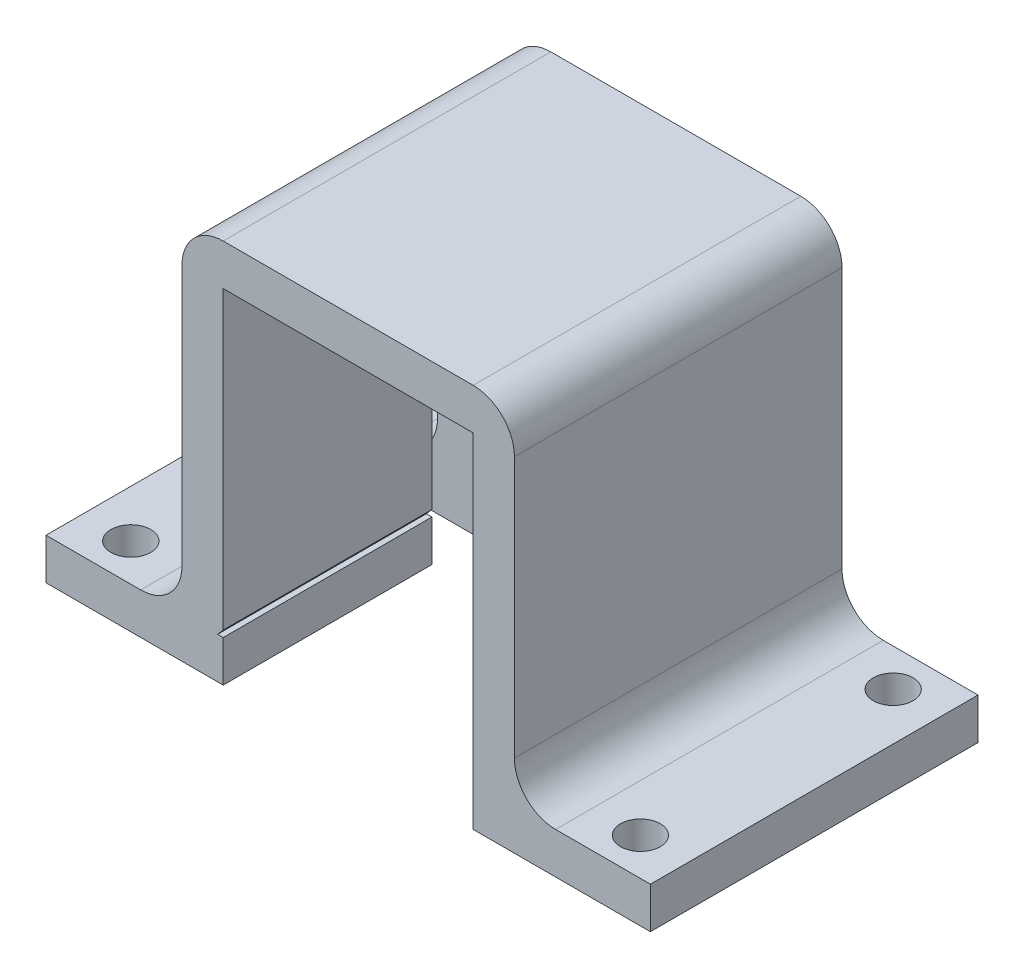
ISO-10303-21;
HEADER;
FILE_DESCRIPTION(('STEP AP214'),'2;1');
FILE_NAME('part.step','',(''),(''),'','','');
FILE_SCHEMA(('AUTOMOTIVE_DESIGN { 1 0 10303 214 1 1 1 1 }'));
ENDSEC;
DATA;
#1=APPLICATION_CONTEXT('core data for automotive mechanical design processes');
#2=APPLICATION_PROTOCOL_DEFINITION('international standard','automotive_design',2000,#1);
#3=PRODUCT_CONTEXT('',#1,'mechanical');
#4=PRODUCT('Part','Part','',(#3));
#5=PRODUCT_RELATED_PRODUCT_CATEGORY('part','',(#4));
#6=PRODUCT_DEFINITION_FORMATION('','',#4);
#7=PRODUCT_DEFINITION_CONTEXT('part definition',#1,'design');
#8=PRODUCT_DEFINITION('design','',#6,#7);
#9=PRODUCT_DEFINITION_SHAPE('','',#8);
#10=(LENGTH_UNIT() NAMED_UNIT(*) SI_UNIT(.MILLI.,.METRE.));
#11=(NAMED_UNIT(*) PLANE_ANGLE_UNIT() SI_UNIT($,.RADIAN.));
#12=(NAMED_UNIT(*) SI_UNIT($,.STERADIAN.) SOLID_ANGLE_UNIT());
#13=UNCERTAINTY_MEASURE_WITH_UNIT(LENGTH_MEASURE(1.E-05),#10,'distance_accuracy_value','');
#14=(GEOMETRIC_REPRESENTATION_CONTEXT(3) GLOBAL_UNCERTAINTY_ASSIGNED_CONTEXT((#13)) GLOBAL_UNIT_ASSIGNED_CONTEXT((#10,
#11,#12)) REPRESENTATION_CONTEXT('',''));
#15=CARTESIAN_POINT('',(0.,0.,0.));
#16=DIRECTION('',(0.,0.,1.));
#17=DIRECTION('',(1.,0.,0.));
#18=AXIS2_PLACEMENT_3D('',#15,#16,#17);
#19=CARTESIAN_POINT('',(0.,-11.,23.85));
#20=DIRECTION('',(0.,1.,0.));
#21=DIRECTION('',(-1.,0.,0.));
#22=AXIS2_PLACEMENT_3D('',#19,#20,#21);
#23=PLANE('',#22);
#24=DIRECTION('',(0.,0.,-1.));
#25=VECTOR('',#24,1.);
#26=CARTESIAN_POINT('',(-9.50714285714286,-11.,23.85));
#27=LINE('',#26,#25);
#28=CARTESIAN_POINT('',(-9.50714285714286,-11.,5.25));
#29=VERTEX_POINT('',#28);
#30=CARTESIAN_POINT('',(-9.50714285714286,-11.,0.));
#31=VERTEX_POINT('',#30);
#32=EDGE_CURVE('E367',#29,#31,#27,.T.);
#33=ORIENTED_EDGE('',*,*,#32,.F.);
#34=DIRECTION('',(1.,0.,0.));
#35=VECTOR('',#34,1.);
#36=CARTESIAN_POINT('',(0.,-11.,5.25));
#37=LINE('',#36,#35);
#38=CARTESIAN_POINT('',(-9.1,-11.,5.25));
#39=VERTEX_POINT('',#38);
#40=EDGE_CURVE('E609',#29,#39,#37,.T.);
#41=ORIENTED_EDGE('',*,*,#40,.T.);
#42=DIRECTION('',(0.,0.,-1.));
#43=VECTOR('',#42,1.);
#44=CARTESIAN_POINT('',(-9.1,-11.,23.85));
#45=LINE('',#44,#43);
#46=CARTESIAN_POINT('',(-9.1,-11.,0.));
#47=VERTEX_POINT('',#46);
#48=EDGE_CURVE('E138',#39,#47,#45,.T.);
#49=ORIENTED_EDGE('',*,*,#48,.T.);
#50=DIRECTION('',(1.,0.,0.));
#51=VECTOR('',#50,1.);
#52=CARTESIAN_POINT('',(0.,-11.,0.));
#53=LINE('',#52,#51);
#54=EDGE_CURVE('E234',#31,#47,#53,.T.);
#55=ORIENTED_EDGE('',*,*,#54,.F.);
#56=EDGE_LOOP('',(#33,#41,#49,#55));
#57=FACE_BOUND('',#56,.T.);
#58=ADVANCED_FACE('F47',(#57),#23,.T.);
#59=CARTESIAN_POINT('',(-9.1,-11.,23.85));
#60=VERTEX_POINT('',#59);
#61=CARTESIAN_POINT('',(-9.1,-11.,8.65000000000001));
#62=VERTEX_POINT('',#61);
#63=EDGE_CURVE('E70',#60,#62,#45,.T.);
#64=ORIENTED_EDGE('',*,*,#63,.T.);
#65=DIRECTION('',(-1.,0.,0.));
#66=VECTOR('',#65,1.);
#67=CARTESIAN_POINT('',(0.,-11.,8.65000000000001));
#68=LINE('',#67,#66);
#69=CARTESIAN_POINT('',(-9.50714285714286,-11.,8.65000000000001));
#70=VERTEX_POINT('',#69);
#71=EDGE_CURVE('E62',#62,#70,#68,.T.);
#72=ORIENTED_EDGE('',*,*,#71,.T.);
#73=CARTESIAN_POINT('',(-9.50714285714286,-11.,23.85));
#74=VERTEX_POINT('',#73);
#75=EDGE_CURVE('E145',#74,#70,#27,.T.);
#76=ORIENTED_EDGE('',*,*,#75,.F.);
#77=DIRECTION('',(1.,0.,0.));
#78=VECTOR('',#77,1.);
#79=CARTESIAN_POINT('',(0.,-11.,23.85));
#80=LINE('',#79,#78);
#81=EDGE_CURVE('E307',#74,#60,#80,.T.);
#82=ORIENTED_EDGE('',*,*,#81,.T.);
#83=EDGE_LOOP('',(#64,#72,#76,#82));
#84=FACE_BOUND('',#83,.T.);
#85=ADVANCED_FACE('F425',(#84),#23,.T.);
#86=CARTESIAN_POINT('',(0.,0.,23.85));
#87=DIRECTION('',(-0.756579928934907,0.65390122429374,0.));
#88=DIRECTION('',(-0.65390122429374,-0.756579928934907,0.));
#89=AXIS2_PLACEMENT_3D('',#86,#87,#88);
#90=PLANE('',#89);
#91=DIRECTION('',(0.65390122429374,0.756579928934907,0.));
#92=VECTOR('',#91,1.);
#93=CARTESIAN_POINT('',(0.,0.,5.25));
#94=LINE('',#93,#92);
#95=CARTESIAN_POINT('',(-9.1,-10.5289256198347,5.25));
#96=VERTEX_POINT('',#95);
#97=EDGE_CURVE('E419',#29,#96,#94,.T.);
#98=ORIENTED_EDGE('',*,*,#97,.F.);
#99=ORIENTED_EDGE('',*,*,#32,.T.);
#100=DIRECTION('',(0.65390122429374,0.756579928934906,0.));
#101=VECTOR('',#100,1.);
#102=CARTESIAN_POINT('',(0.,0.,0.));
#103=LINE('',#102,#101);
#104=CARTESIAN_POINT('',(-9.1,-10.5289256198347,0.));
#105=VERTEX_POINT('',#104);
#106=EDGE_CURVE('E237',#31,#105,#103,.T.);
#107=ORIENTED_EDGE('',*,*,#106,.T.);
#108=DIRECTION('',(0.,0.,-1.));
#109=VECTOR('',#108,1.);
#110=CARTESIAN_POINT('',(-9.1,-10.5289256198347,23.85));
#111=LINE('',#110,#109);
#112=EDGE_CURVE('E362',#96,#105,#111,.T.);
#113=ORIENTED_EDGE('',*,*,#112,.F.);
#114=EDGE_LOOP('',(#98,#99,#107,#113));
#115=FACE_BOUND('',#114,.T.);
#116=ADVANCED_FACE('F415',(#115),#90,.F.);
#117=DIRECTION('',(-0.65390122429374,-0.756579928934907,0.));
#118=VECTOR('',#117,1.);
#119=CARTESIAN_POINT('',(0.,0.,8.65000000000001));
#120=LINE('',#119,#118);
#121=CARTESIAN_POINT('',(-9.1,-10.5289256198347,8.65000000000001));
#122=VERTEX_POINT('',#121);
#123=EDGE_CURVE('E635',#122,#70,#120,.T.);
#124=ORIENTED_EDGE('',*,*,#123,.F.);
#125=CARTESIAN_POINT('',(-9.1,-10.5289256198347,23.85));
#126=VERTEX_POINT('',#125);
#127=EDGE_CURVE('E363',#126,#122,#111,.T.);
#128=ORIENTED_EDGE('',*,*,#127,.F.);
#129=DIRECTION('',(0.65390122429374,0.756579928934906,0.));
#130=VECTOR('',#129,1.);
#131=CARTESIAN_POINT('',(0.,0.,23.85));
#132=LINE('',#131,#130);
#133=EDGE_CURVE('E436',#74,#126,#132,.T.);
#134=ORIENTED_EDGE('',*,*,#133,.F.);
#135=ORIENTED_EDGE('',*,*,#75,.T.);
#136=EDGE_LOOP('',(#124,#128,#134,#135));
#137=FACE_BOUND('',#136,.T.);
#138=ADVANCED_FACE('F433',(#137),#90,.F.);
#139=CARTESIAN_POINT('',(-9.1,0.,23.85));
#140=DIRECTION('',(1.,0.,0.));
#141=DIRECTION('',(0.,1.,0.));
#142=AXIS2_PLACEMENT_3D('',#139,#140,#141);
#143=PLANE('',#142);
#144=DIRECTION('',(0.,0.,-1.));
#145=VECTOR('',#144,1.);
#146=CARTESIAN_POINT('',(-9.1,6.,23.85));
#147=LINE('',#146,#145);
#148=CARTESIAN_POINT('',(-9.1,6.,8.65000000000001));
#149=VERTEX_POINT('',#148);
#150=CARTESIAN_POINT('',(-9.1,6.,5.25));
#151=VERTEX_POINT('',#150);
#152=EDGE_CURVE('E490',#149,#151,#147,.T.);
#153=ORIENTED_EDGE('',*,*,#152,.T.);
#154=DIRECTION('',(0.,-1.,0.));
#155=VECTOR('',#154,1.);
#156=CARTESIAN_POINT('',(-9.1,0.,5.25));
#157=LINE('',#156,#155);
#158=EDGE_CURVE('E514',#151,#96,#157,.T.);
#159=ORIENTED_EDGE('',*,*,#158,.T.);
#160=ORIENTED_EDGE('',*,*,#112,.T.);
#161=DIRECTION('',(0.,-1.,0.));
#162=VECTOR('',#161,1.);
#163=CARTESIAN_POINT('',(-9.1,0.,0.));
#164=LINE('',#163,#162);
#165=CARTESIAN_POINT('',(-9.1,11.,0.));
#166=VERTEX_POINT('',#165);
#167=EDGE_CURVE('E242',#166,#105,#164,.T.);
#168=ORIENTED_EDGE('',*,*,#167,.F.);
#169=DIRECTION('',(0.,0.,-1.));
#170=VECTOR('',#169,1.);
#171=CARTESIAN_POINT('',(-9.1,11.,23.85));
#172=LINE('',#171,#170);
#173=CARTESIAN_POINT('',(-9.1,11.,23.85));
#174=VERTEX_POINT('',#173);
#175=EDGE_CURVE('E359',#174,#166,#172,.T.);
#176=ORIENTED_EDGE('',*,*,#175,.F.);
#177=DIRECTION('',(0.,-1.,0.));
#178=VECTOR('',#177,1.);
#179=CARTESIAN_POINT('',(-9.1,0.,23.85));
#180=LINE('',#179,#178);
#181=EDGE_CURVE('E544',#174,#126,#180,.T.);
#182=ORIENTED_EDGE('',*,*,#181,.T.);
#183=ORIENTED_EDGE('',*,*,#127,.T.);
#184=DIRECTION('',(0.,1.,0.));
#185=VECTOR('',#184,1.);
#186=CARTESIAN_POINT('',(-9.1,0.,8.65000000000001));
#187=LINE('',#186,#185);
#188=EDGE_CURVE('E603',#122,#149,#187,.T.);
#189=ORIENTED_EDGE('',*,*,#188,.T.);
#190=EDGE_LOOP('',(#153,#159,#160,#168,#176,#182,#183,#189));
#191=FACE_BOUND('',#190,.T.);
#192=ADVANCED_FACE('F616',(#191),#143,.T.);
#193=CARTESIAN_POINT('',(-12.1,0.,23.85));
#194=DIRECTION('',(1.,0.,0.));
#195=DIRECTION('',(0.,0.,-1.));
#196=AXIS2_PLACEMENT_3D('',#193,#194,#195);
#197=PLANE('',#196);
#198=DIRECTION('',(0.,-1.,0.));
#199=VECTOR('',#198,1.);
#200=CARTESIAN_POINT('',(-12.1,0.,5.25));
#201=LINE('',#200,#199);
#202=CARTESIAN_POINT('',(-12.1,6.,5.25));
#203=VERTEX_POINT('',#202);
#204=CARTESIAN_POINT('',(-12.1,-8.,5.25));
#205=VERTEX_POINT('',#204);
#206=EDGE_CURVE('E482',#203,#205,#201,.T.);
#207=ORIENTED_EDGE('',*,*,#206,.F.);
#208=DIRECTION('',(0.,0.,-1.));
#209=VECTOR('',#208,1.);
#210=CARTESIAN_POINT('',(-12.1,6.,23.85));
#211=LINE('',#210,#209);
#212=CARTESIAN_POINT('',(-12.1,6.,8.65000000000001));
#213=VERTEX_POINT('',#212);
#214=EDGE_CURVE('E11',#213,#203,#211,.T.);
#215=ORIENTED_EDGE('',*,*,#214,.F.);
#216=DIRECTION('',(0.,1.,0.));
#217=VECTOR('',#216,1.);
#218=CARTESIAN_POINT('',(-12.1,0.,8.65000000000001));
#219=LINE('',#218,#217);
#220=CARTESIAN_POINT('',(-12.1,-7.99999999999998,8.65000000000001));
#221=VERTEX_POINT('',#220);
#222=EDGE_CURVE('E601',#221,#213,#219,.T.);
#223=ORIENTED_EDGE('',*,*,#222,.F.);
#224=DIRECTION('',(0.,0.,-1.));
#225=VECTOR('',#224,1.);
#226=CARTESIAN_POINT('',(-12.1,-7.99999999999998,23.85));
#227=LINE('',#226,#225);
#228=CARTESIAN_POINT('',(-12.1,-7.99999999999998,23.85));
#229=VERTEX_POINT('',#228);
#230=EDGE_CURVE('E322',#229,#221,#227,.T.);
#231=ORIENTED_EDGE('',*,*,#230,.F.);
#232=DIRECTION('',(0.,-1.,0.));
#233=VECTOR('',#232,1.);
#234=CARTESIAN_POINT('',(-12.1,0.,23.85));
#235=LINE('',#234,#233);
#236=CARTESIAN_POINT('',(-12.1,11.,23.85));
#237=VERTEX_POINT('',#236);
#238=EDGE_CURVE('E584',#237,#229,#235,.T.);
#239=ORIENTED_EDGE('',*,*,#238,.F.);
#240=DIRECTION('',(0.,0.,-1.));
#241=VECTOR('',#240,1.);
#242=CARTESIAN_POINT('',(-12.1,11.,23.85));
#243=LINE('',#242,#241);
#244=CARTESIAN_POINT('',(-12.1,11.,0.));
#245=VERTEX_POINT('',#244);
#246=EDGE_CURVE('E326',#237,#245,#243,.T.);
#247=ORIENTED_EDGE('',*,*,#246,.T.);
#248=DIRECTION('',(0.,-1.,0.));
#249=VECTOR('',#248,1.);
#250=CARTESIAN_POINT('',(-12.1,0.,0.));
#251=LINE('',#250,#249);
#252=CARTESIAN_POINT('',(-12.1,-7.99999999999998,0.));
#253=VERTEX_POINT('',#252);
#254=EDGE_CURVE('E283',#245,#253,#251,.T.);
#255=ORIENTED_EDGE('',*,*,#254,.T.);
#256=EDGE_CURVE('E321',#205,#253,#227,.T.);
#257=ORIENTED_EDGE('',*,*,#256,.F.);
#258=EDGE_LOOP('',(#207,#215,#223,#231,#239,#247,#255,#257));
#259=FACE_BOUND('',#258,.T.);
#260=ADVANCED_FACE('F498',(#259),#197,.F.);
#261=CARTESIAN_POINT('',(-15.1,-8.,23.85));
#262=DIRECTION('',(0.,0.,-1.));
#263=DIRECTION('',(-1.,0.,0.));
#264=AXIS2_PLACEMENT_3D('',#261,#262,#263);
#265=CYLINDRICAL_SURFACE('',#264,3.);
#266=CARTESIAN_POINT('',(-15.1,-8.,5.25));
#267=DIRECTION('',(0.,0.,1.));
#268=DIRECTION('',(1.,0.,0.));
#269=AXIS2_PLACEMENT_3D('',#266,#267,#268);
#270=CIRCLE('',#269,3.);
#271=CARTESIAN_POINT('',(-15.1,-11.,5.25));
#272=VERTEX_POINT('',#271);
#273=EDGE_CURVE('E478',#205,#272,#270,.F.);
#274=ORIENTED_EDGE('',*,*,#273,.F.);
#275=ORIENTED_EDGE('',*,*,#256,.T.);
#276=CARTESIAN_POINT('',(-15.1,-8.,0.));
#277=DIRECTION('',(0.,0.,1.));
#278=DIRECTION('',(1.,0.,0.));
#279=AXIS2_PLACEMENT_3D('',#276,#277,#278);
#280=CIRCLE('',#279,3.);
#281=CARTESIAN_POINT('',(-15.1,-11.,0.));
#282=VERTEX_POINT('',#281);
#283=EDGE_CURVE('E287',#253,#282,#280,.F.);
#284=ORIENTED_EDGE('',*,*,#283,.T.);
#285=DIRECTION('',(0.,0.,-1.));
#286=VECTOR('',#285,1.);
#287=CARTESIAN_POINT('',(-15.1,-11.,23.85));
#288=LINE('',#287,#286);
#289=EDGE_CURVE('E316',#272,#282,#288,.T.);
#290=ORIENTED_EDGE('',*,*,#289,.F.);
#291=EDGE_LOOP('',(#274,#275,#284,#290));
#292=FACE_BOUND('',#291,.T.);
#293=ADVANCED_FACE('F494',(#292),#265,.F.);
#294=CARTESIAN_POINT('',(-15.1,-8.,8.65000000000001));
#295=DIRECTION('',(0.,0.,-1.));
#296=DIRECTION('',(-1.,0.,0.));
#297=AXIS2_PLACEMENT_3D('',#294,#295,#296);
#298=CIRCLE('',#297,3.);
#299=CARTESIAN_POINT('',(-15.1,-11.,8.65000000000001));
#300=VERTEX_POINT('',#299);
#301=EDGE_CURVE('E597',#300,#221,#298,.F.);
#302=ORIENTED_EDGE('',*,*,#301,.F.);
#303=CARTESIAN_POINT('',(-15.1,-11.,23.85));
#304=VERTEX_POINT('',#303);
#305=EDGE_CURVE('E317',#304,#300,#288,.T.);
#306=ORIENTED_EDGE('',*,*,#305,.F.);
#307=CARTESIAN_POINT('',(-15.1,-8.,23.85));
#308=DIRECTION('',(0.,0.,1.));
#309=DIRECTION('',(1.,0.,0.));
#310=AXIS2_PLACEMENT_3D('',#307,#308,#309);
#311=CIRCLE('',#310,3.);
#312=EDGE_CURVE('E587',#229,#304,#311,.F.);
#313=ORIENTED_EDGE('',*,*,#312,.F.);
#314=ORIENTED_EDGE('',*,*,#230,.T.);
#315=EDGE_LOOP('',(#302,#306,#313,#314));
#316=FACE_BOUND('',#315,.T.);
#317=ADVANCED_FACE('F688',(#316),#265,.F.);
#318=CARTESIAN_POINT('',(0.,-11.,23.85));
#319=DIRECTION('',(0.,1.,0.));
#320=DIRECTION('',(-1.,0.,0.));
#321=AXIS2_PLACEMENT_3D('',#318,#319,#320);
#322=PLANE('',#321);
#323=CARTESIAN_POINT('',(-18.55,-11.,2.72499999999999));
#324=DIRECTION('',(0.,1.,0.));
#325=DIRECTION('',(1.,0.,0.));
#326=AXIS2_PLACEMENT_3D('',#323,#324,#325);
#327=CIRCLE('',#326,1.45);
#328=CARTESIAN_POINT('',(-17.1,-11.,2.72499999999999));
#329=VERTEX_POINT('',#328);
#330=EDGE_CURVE('E526',#329,#329,#327,.T.);
#331=ORIENTED_EDGE('',*,*,#330,.F.);
#332=EDGE_LOOP('',(#331));
#333=FACE_BOUND('',#332,.T.);
#334=DIRECTION('',(0.,0.,-1.));
#335=VECTOR('',#334,1.);
#336=CARTESIAN_POINT('',(-22.,-11.,23.85));
#337=LINE('',#336,#335);
#338=CARTESIAN_POINT('',(-22.,-11.,5.25));
#339=VERTEX_POINT('',#338);
#340=CARTESIAN_POINT('',(-22.,-11.,0.));
#341=VERTEX_POINT('',#340);
#342=EDGE_CURVE('E221',#339,#341,#337,.T.);
#343=ORIENTED_EDGE('',*,*,#342,.F.);
#344=DIRECTION('',(1.,0.,0.));
#345=VECTOR('',#344,1.);
#346=CARTESIAN_POINT('',(0.,-11.,5.25));
#347=LINE('',#346,#345);
#348=EDGE_CURVE('E496',#339,#272,#347,.T.);
#349=ORIENTED_EDGE('',*,*,#348,.T.);
#350=ORIENTED_EDGE('',*,*,#289,.T.);
#351=DIRECTION('',(1.,0.,0.));
#352=VECTOR('',#351,1.);
#353=CARTESIAN_POINT('',(0.,-11.,0.));
#354=LINE('',#353,#352);
#355=EDGE_CURVE('E291',#341,#282,#354,.T.);
#356=ORIENTED_EDGE('',*,*,#355,.F.);
#357=EDGE_LOOP('',(#343,#349,#350,#356));
#358=FACE_BOUND('',#357,.T.);
#359=ADVANCED_FACE('F508',(#333,#358),#322,.T.);
#360=CARTESIAN_POINT('',(-18.55,-11.,21.125));
#361=DIRECTION('',(0.,1.,0.));
#362=DIRECTION('',(-1.,0.,0.));
#363=AXIS2_PLACEMENT_3D('',#360,#361,#362);
#364=CIRCLE('',#363,1.45);
#365=CARTESIAN_POINT('',(-20.,-11.,21.125));
#366=VERTEX_POINT('',#365);
#367=EDGE_CURVE('E376',#366,#366,#364,.T.);
#368=ORIENTED_EDGE('',*,*,#367,.F.);
#369=EDGE_LOOP('',(#368));
#370=FACE_BOUND('',#369,.T.);
#371=ORIENTED_EDGE('',*,*,#305,.T.);
#372=DIRECTION('',(-1.,0.,0.));
#373=VECTOR('',#372,1.);
#374=CARTESIAN_POINT('',(0.,-11.,8.65000000000001));
#375=LINE('',#374,#373);
#376=CARTESIAN_POINT('',(-22.,-11.,8.65000000000001));
#377=VERTEX_POINT('',#376);
#378=EDGE_CURVE('E594',#300,#377,#375,.T.);
#379=ORIENTED_EDGE('',*,*,#378,.T.);
#380=CARTESIAN_POINT('',(-22.,-11.,23.85));
#381=VERTEX_POINT('',#380);
#382=EDGE_CURVE('E313',#381,#377,#337,.T.);
#383=ORIENTED_EDGE('',*,*,#382,.F.);
#384=DIRECTION('',(1.,0.,0.));
#385=VECTOR('',#384,1.);
#386=CARTESIAN_POINT('',(0.,-11.,23.85));
#387=LINE('',#386,#385);
#388=EDGE_CURVE('E206',#381,#304,#387,.T.);
#389=ORIENTED_EDGE('',*,*,#388,.T.);
#390=EDGE_LOOP('',(#371,#379,#383,#389));
#391=FACE_BOUND('',#390,.T.);
#392=ADVANCED_FACE('F591',(#370,#391),#322,.T.);
#393=CARTESIAN_POINT('',(-22.,0.,23.85));
#394=DIRECTION('',(1.,0.,0.));
#395=DIRECTION('',(0.,0.,-1.));
#396=AXIS2_PLACEMENT_3D('',#393,#394,#395);
#397=PLANE('',#396);
#398=DIRECTION('',(0.,-1.,0.));
#399=VECTOR('',#398,1.);
#400=CARTESIAN_POINT('',(-22.,0.,5.25));
#401=LINE('',#400,#399);
#402=CARTESIAN_POINT('',(-22.,-14.,5.25));
#403=VERTEX_POINT('',#402);
#404=EDGE_CURVE('E511',#339,#403,#401,.T.);
#405=ORIENTED_EDGE('',*,*,#404,.F.);
#406=ORIENTED_EDGE('',*,*,#342,.T.);
#407=DIRECTION('',(0.,-1.,0.));
#408=VECTOR('',#407,1.);
#409=CARTESIAN_POINT('',(-22.,0.,0.));
#410=LINE('',#409,#408);
#411=CARTESIAN_POINT('',(-22.,-14.,0.));
#412=VERTEX_POINT('',#411);
#413=EDGE_CURVE('E295',#341,#412,#410,.T.);
#414=ORIENTED_EDGE('',*,*,#413,.T.);
#415=DIRECTION('',(0.,0.,-1.));
#416=VECTOR('',#415,1.);
#417=CARTESIAN_POINT('',(-22.,-14.,23.85));
#418=LINE('',#417,#416);
#419=EDGE_CURVE('E222',#403,#412,#418,.T.);
#420=ORIENTED_EDGE('',*,*,#419,.F.);
#421=EDGE_LOOP('',(#405,#406,#414,#420));
#422=FACE_BOUND('',#421,.T.);
#423=ADVANCED_FACE('F799',(#422),#397,.F.);
#424=DIRECTION('',(0.,1.,0.));
#425=VECTOR('',#424,1.);
#426=CARTESIAN_POINT('',(-22.,0.,8.65000000000001));
#427=LINE('',#426,#425);
#428=CARTESIAN_POINT('',(-22.,-14.,8.65000000000001));
#429=VERTEX_POINT('',#428);
#430=EDGE_CURVE('E217',#429,#377,#427,.T.);
#431=ORIENTED_EDGE('',*,*,#430,.F.);
#432=CARTESIAN_POINT('',(-22.,-14.,23.85));
#433=VERTEX_POINT('',#432);
#434=EDGE_CURVE('E213',#433,#429,#418,.T.);
#435=ORIENTED_EDGE('',*,*,#434,.F.);
#436=DIRECTION('',(0.,-1.,0.));
#437=VECTOR('',#436,1.);
#438=CARTESIAN_POINT('',(-22.,0.,23.85));
#439=LINE('',#438,#437);
#440=EDGE_CURVE('E197',#381,#433,#439,.T.);
#441=ORIENTED_EDGE('',*,*,#440,.F.);
#442=ORIENTED_EDGE('',*,*,#382,.T.);
#443=EDGE_LOOP('',(#431,#435,#441,#442));
#444=FACE_BOUND('',#443,.T.);
#445=ADVANCED_FACE('F214',(#444),#397,.F.);
#446=CARTESIAN_POINT('',(0.,-14.,23.85));
#447=DIRECTION('',(0.,1.,0.));
#448=DIRECTION('',(-1.,0.,0.));
#449=AXIS2_PLACEMENT_3D('',#446,#447,#448);
#450=PLANE('',#449);
#451=CARTESIAN_POINT('',(-18.55,-14.,2.72499999999999));
#452=DIRECTION('',(0.,1.,0.));
#453=DIRECTION('',(-1.,0.,0.));
#454=AXIS2_PLACEMENT_3D('',#451,#452,#453);
#455=CIRCLE('',#454,1.45);
#456=CARTESIAN_POINT('',(-20.,-14.,2.72499999999999));
#457=VERTEX_POINT('',#456);
#458=EDGE_CURVE('E375',#457,#457,#455,.T.);
#459=ORIENTED_EDGE('',*,*,#458,.T.);
#460=EDGE_LOOP('',(#459));
#461=FACE_BOUND('',#460,.T.);
#462=DIRECTION('',(1.,0.,0.));
#463=VECTOR('',#462,1.);
#464=CARTESIAN_POINT('',(-22.1,-14.,5.25));
#465=LINE('',#464,#463);
#466=CARTESIAN_POINT('',(-9.1,-14.,5.25));
#467=VERTEX_POINT('',#466);
#468=EDGE_CURVE('E400',#403,#467,#465,.T.);
#469=ORIENTED_EDGE('',*,*,#468,.F.);
#470=ORIENTED_EDGE('',*,*,#419,.T.);
#471=DIRECTION('',(1.,0.,0.));
#472=VECTOR('',#471,1.);
#473=CARTESIAN_POINT('',(0.,-14.,0.));
#474=LINE('',#473,#472);
#475=CARTESIAN_POINT('',(-9.1,-14.,0.));
#476=VERTEX_POINT('',#475);
#477=EDGE_CURVE('E299',#412,#476,#474,.T.);
#478=ORIENTED_EDGE('',*,*,#477,.T.);
#479=DIRECTION('',(0.,0.,-1.));
#480=VECTOR('',#479,1.);
#481=CARTESIAN_POINT('',(-9.1,-14.,23.85));
#482=LINE('',#481,#480);
#483=EDGE_CURVE('E310',#467,#476,#482,.T.);
#484=ORIENTED_EDGE('',*,*,#483,.F.);
#485=EDGE_LOOP('',(#469,#470,#478,#484));
#486=FACE_BOUND('',#485,.T.);
#487=ADVANCED_FACE('F399',(#461,#486),#450,.F.);
#488=CARTESIAN_POINT('',(-18.55,-14.,21.125));
#489=DIRECTION('',(0.,1.,0.));
#490=DIRECTION('',(-1.,0.,0.));
#491=AXIS2_PLACEMENT_3D('',#488,#489,#490);
#492=CIRCLE('',#491,1.45);
#493=CARTESIAN_POINT('',(-20.,-14.,21.125));
#494=VERTEX_POINT('',#493);
#495=EDGE_CURVE('E371',#494,#494,#492,.T.);
#496=ORIENTED_EDGE('',*,*,#495,.T.);
#497=EDGE_LOOP('',(#496));
#498=FACE_BOUND('',#497,.T.);
#499=DIRECTION('',(1.,0.,0.));
#500=VECTOR('',#499,1.);
#501=CARTESIAN_POINT('',(-22.1,-14.,8.65000000000001));
#502=LINE('',#501,#500);
#503=CARTESIAN_POINT('',(-9.1,-14.,8.65000000000001));
#504=VERTEX_POINT('',#503);
#505=EDGE_CURVE('E626',#429,#504,#502,.T.);
#506=ORIENTED_EDGE('',*,*,#505,.T.);
#507=CARTESIAN_POINT('',(-9.1,-14.,23.85));
#508=VERTEX_POINT('',#507);
#509=EDGE_CURVE('E226',#508,#504,#482,.T.);
#510=ORIENTED_EDGE('',*,*,#509,.F.);
#511=DIRECTION('',(1.,0.,0.));
#512=VECTOR('',#511,1.);
#513=CARTESIAN_POINT('',(0.,-14.,23.85));
#514=LINE('',#513,#512);
#515=EDGE_CURVE('E203',#433,#508,#514,.T.);
#516=ORIENTED_EDGE('',*,*,#515,.F.);
#517=ORIENTED_EDGE('',*,*,#434,.T.);
#518=EDGE_LOOP('',(#506,#510,#516,#517));
#519=FACE_BOUND('',#518,.T.);
#520=ADVANCED_FACE('F224',(#498,#519),#450,.F.);
#521=CARTESIAN_POINT('',(-9.1,0.,23.85));
#522=DIRECTION('',(1.,0.,0.));
#523=DIRECTION('',(0.,0.,-1.));
#524=AXIS2_PLACEMENT_3D('',#521,#522,#523);
#525=PLANE('',#524);
#526=ORIENTED_EDGE('',*,*,#48,.F.);
#527=DIRECTION('',(0.,-1.,0.));
#528=VECTOR('',#527,1.);
#529=CARTESIAN_POINT('',(-9.1,0.,5.25));
#530=LINE('',#529,#528);
#531=EDGE_CURVE('E55',#39,#467,#530,.T.);
#532=ORIENTED_EDGE('',*,*,#531,.T.);
#533=ORIENTED_EDGE('',*,*,#483,.T.);
#534=DIRECTION('',(0.,-1.,0.));
#535=VECTOR('',#534,1.);
#536=CARTESIAN_POINT('',(-9.1,0.,0.));
#537=LINE('',#536,#535);
#538=EDGE_CURVE('E303',#47,#476,#537,.T.);
#539=ORIENTED_EDGE('',*,*,#538,.F.);
#540=EDGE_LOOP('',(#526,#532,#533,#539));
#541=FACE_BOUND('',#540,.T.);
#542=ADVANCED_FACE('F388',(#541),#525,.T.);
#543=ORIENTED_EDGE('',*,*,#509,.T.);
#544=DIRECTION('',(0.,1.,0.));
#545=VECTOR('',#544,1.);
#546=CARTESIAN_POINT('',(-9.1,0.,8.65000000000001));
#547=LINE('',#546,#545);
#548=EDGE_CURVE('E370',#504,#62,#547,.T.);
#549=ORIENTED_EDGE('',*,*,#548,.T.);
#550=ORIENTED_EDGE('',*,*,#63,.F.);
#551=DIRECTION('',(0.,-1.,0.));
#552=VECTOR('',#551,1.);
#553=CARTESIAN_POINT('',(-9.1,0.,23.85));
#554=LINE('',#553,#552);
#555=EDGE_CURVE('E228',#60,#508,#554,.T.);
#556=ORIENTED_EDGE('',*,*,#555,.T.);
#557=EDGE_LOOP('',(#543,#549,#550,#556));
#558=FACE_BOUND('',#557,.T.);
#559=ADVANCED_FACE('F438',(#558),#525,.T.);
#560=CARTESIAN_POINT('',(0.,11.,23.85));
#561=DIRECTION('',(0.,1.,0.));
#562=DIRECTION('',(0.,0.,1.));
#563=AXIS2_PLACEMENT_3D('',#560,#561,#562);
#564=PLANE('',#563);
#565=DIRECTION('',(1.,0.,0.));
#566=VECTOR('',#565,1.);
#567=CARTESIAN_POINT('',(0.,11.,0.));
#568=LINE('',#567,#566);
#569=CARTESIAN_POINT('',(9.1,11.,0.));
#570=VERTEX_POINT('',#569);
#571=EDGE_CURVE('E246',#166,#570,#568,.T.);
#572=ORIENTED_EDGE('',*,*,#571,.T.);
#573=DIRECTION('',(0.,0.,-1.));
#574=VECTOR('',#573,1.);
#575=CARTESIAN_POINT('',(9.1,11.,23.85));
#576=LINE('',#575,#574);
#577=CARTESIAN_POINT('',(9.1,11.,23.85));
#578=VERTEX_POINT('',#577);
#579=EDGE_CURVE('E355',#578,#570,#576,.T.);
#580=ORIENTED_EDGE('',*,*,#579,.F.);
#581=DIRECTION('',(1.,0.,0.));
#582=VECTOR('',#581,1.);
#583=CARTESIAN_POINT('',(0.,11.,23.85));
#584=LINE('',#583,#582);
#585=EDGE_CURVE('E548',#174,#578,#584,.T.);
#586=ORIENTED_EDGE('',*,*,#585,.F.);
#587=ORIENTED_EDGE('',*,*,#175,.T.);
#588=EDGE_LOOP('',(#572,#580,#586,#587));
#589=FACE_BOUND('',#588,.T.);
#590=ADVANCED_FACE('F646',(#589),#564,.F.);
#591=CARTESIAN_POINT('',(9.1,0.,23.85));
#592=DIRECTION('',(1.,0.,0.));
#593=DIRECTION('',(0.,0.,-1.));
#594=AXIS2_PLACEMENT_3D('',#591,#592,#593);
#595=PLANE('',#594);
#596=DIRECTION('',(0.,-1.,0.));
#597=VECTOR('',#596,1.);
#598=CARTESIAN_POINT('',(9.1,0.,0.));
#599=LINE('',#598,#597);
#600=CARTESIAN_POINT('',(9.1,-14.,0.));
#601=VERTEX_POINT('',#600);
#602=EDGE_CURVE('E249',#570,#601,#599,.T.);
#603=ORIENTED_EDGE('',*,*,#602,.T.);
#604=DIRECTION('',(0.,0.,-1.));
#605=VECTOR('',#604,1.);
#606=CARTESIAN_POINT('',(9.1,-14.,23.85));
#607=LINE('',#606,#605);
#608=CARTESIAN_POINT('',(9.1,-14.,23.85));
#609=VERTEX_POINT('',#608);
#610=EDGE_CURVE('E351',#609,#601,#607,.T.);
#611=ORIENTED_EDGE('',*,*,#610,.F.);
#612=DIRECTION('',(0.,-1.,0.));
#613=VECTOR('',#612,1.);
#614=CARTESIAN_POINT('',(9.1,0.,23.85));
#615=LINE('',#614,#613);
#616=EDGE_CURVE('E551',#578,#609,#615,.T.);
#617=ORIENTED_EDGE('',*,*,#616,.F.);
#618=ORIENTED_EDGE('',*,*,#579,.T.);
#619=EDGE_LOOP('',(#603,#611,#617,#618));
#620=FACE_BOUND('',#619,.T.);
#621=ADVANCED_FACE('F651',(#620),#595,.F.);
#622=CARTESIAN_POINT('',(0.,-14.,23.85));
#623=DIRECTION('',(0.,1.,0.));
#624=DIRECTION('',(0.,0.,1.));
#625=AXIS2_PLACEMENT_3D('',#622,#623,#624);
#626=PLANE('',#625);
#627=CARTESIAN_POINT('',(18.55,-14.,21.125));
#628=DIRECTION('',(0.,1.,0.));
#629=DIRECTION('',(0.,0.,1.));
#630=AXIS2_PLACEMENT_3D('',#627,#628,#629);
#631=CIRCLE('',#630,1.45);
#632=CARTESIAN_POINT('',(18.55,-14.,22.575));
#633=VERTEX_POINT('',#632);
#634=EDGE_CURVE('E238',#633,#633,#631,.T.);
#635=ORIENTED_EDGE('',*,*,#634,.T.);
#636=EDGE_LOOP('',(#635));
#637=FACE_BOUND('',#636,.T.);
#638=CARTESIAN_POINT('',(18.55,-14.,2.72499999999999));
#639=DIRECTION('',(0.,1.,0.));
#640=DIRECTION('',(0.,0.,1.));
#641=AXIS2_PLACEMENT_3D('',#638,#639,#640);
#642=CIRCLE('',#641,1.45);
#643=CARTESIAN_POINT('',(18.55,-14.,4.17499999999999));
#644=VERTEX_POINT('',#643);
#645=EDGE_CURVE('E380',#644,#644,#642,.T.);
#646=ORIENTED_EDGE('',*,*,#645,.T.);
#647=EDGE_LOOP('',(#646));
#648=FACE_BOUND('',#647,.T.);
#649=DIRECTION('',(1.,0.,0.));
#650=VECTOR('',#649,1.);
#651=CARTESIAN_POINT('',(0.,-14.,0.));
#652=LINE('',#651,#650);
#653=CARTESIAN_POINT('',(22.,-14.,0.));
#654=VERTEX_POINT('',#653);
#655=EDGE_CURVE('E252',#601,#654,#652,.T.);
#656=ORIENTED_EDGE('',*,*,#655,.T.);
#657=DIRECTION('',(0.,0.,-1.));
#658=VECTOR('',#657,1.);
#659=CARTESIAN_POINT('',(22.,-14.,23.85));
#660=LINE('',#659,#658);
#661=CARTESIAN_POINT('',(22.,-14.,23.85));
#662=VERTEX_POINT('',#661);
#663=EDGE_CURVE('E348',#662,#654,#660,.T.);
#664=ORIENTED_EDGE('',*,*,#663,.F.);
#665=DIRECTION('',(1.,0.,0.));
#666=VECTOR('',#665,1.);
#667=CARTESIAN_POINT('',(0.,-14.,23.85));
#668=LINE('',#667,#666);
#669=EDGE_CURVE('E554',#609,#662,#668,.T.);
#670=ORIENTED_EDGE('',*,*,#669,.F.);
#671=ORIENTED_EDGE('',*,*,#610,.T.);
#672=EDGE_LOOP('',(#656,#664,#670,#671));
#673=FACE_BOUND('',#672,.T.);
#674=ADVANCED_FACE('F657',(#637,#648,#673),#626,.F.);
#675=CARTESIAN_POINT('',(22.,0.,23.85));
#676=DIRECTION('',(1.,0.,0.));
#677=DIRECTION('',(0.,1.,0.));
#678=AXIS2_PLACEMENT_3D('',#675,#676,#677);
#679=PLANE('',#678);
#680=DIRECTION('',(0.,-1.,0.));
#681=VECTOR('',#680,1.);
#682=CARTESIAN_POINT('',(22.,0.,0.));
#683=LINE('',#682,#681);
#684=CARTESIAN_POINT('',(22.,-11.,0.));
#685=VERTEX_POINT('',#684);
#686=EDGE_CURVE('E256',#685,#654,#683,.T.);
#687=ORIENTED_EDGE('',*,*,#686,.F.);
#688=DIRECTION('',(0.,0.,-1.));
#689=VECTOR('',#688,1.);
#690=CARTESIAN_POINT('',(22.,-11.,23.85));
#691=LINE('',#690,#689);
#692=CARTESIAN_POINT('',(22.,-11.,23.85));
#693=VERTEX_POINT('',#692);
#694=EDGE_CURVE('E345',#693,#685,#691,.T.);
#695=ORIENTED_EDGE('',*,*,#694,.F.);
#696=DIRECTION('',(0.,-1.,0.));
#697=VECTOR('',#696,1.);
#698=CARTESIAN_POINT('',(22.,0.,23.85));
#699=LINE('',#698,#697);
#700=EDGE_CURVE('E557',#693,#662,#699,.T.);
#701=ORIENTED_EDGE('',*,*,#700,.T.);
#702=ORIENTED_EDGE('',*,*,#663,.T.);
#703=EDGE_LOOP('',(#687,#695,#701,#702));
#704=FACE_BOUND('',#703,.T.);
#705=ADVANCED_FACE('F661',(#704),#679,.T.);
#706=CARTESIAN_POINT('',(0.,-11.,23.85));
#707=DIRECTION('',(0.,1.,0.));
#708=DIRECTION('',(-1.,0.,0.));
#709=AXIS2_PLACEMENT_3D('',#706,#707,#708);
#710=PLANE('',#709);
#711=CARTESIAN_POINT('',(18.55,-11.,21.125));
#712=DIRECTION('',(0.,1.,0.));
#713=DIRECTION('',(1.,0.,0.));
#714=AXIS2_PLACEMENT_3D('',#711,#712,#713);
#715=CIRCLE('',#714,1.45);
#716=CARTESIAN_POINT('',(20.,-11.,21.125));
#717=VERTEX_POINT('',#716);
#718=EDGE_CURVE('E525',#717,#717,#715,.T.);
#719=ORIENTED_EDGE('',*,*,#718,.F.);
#720=EDGE_LOOP('',(#719));
#721=FACE_BOUND('',#720,.T.);
#722=CARTESIAN_POINT('',(18.55,-11.,2.72499999999999));
#723=DIRECTION('',(0.,1.,0.));
#724=DIRECTION('',(-1.,0.,0.));
#725=AXIS2_PLACEMENT_3D('',#722,#723,#724);
#726=CIRCLE('',#725,1.45);
#727=CARTESIAN_POINT('',(17.1,-11.,2.72499999999999));
#728=VERTEX_POINT('',#727);
#729=EDGE_CURVE('E521',#728,#728,#726,.T.);
#730=ORIENTED_EDGE('',*,*,#729,.F.);
#731=EDGE_LOOP('',(#730));
#732=FACE_BOUND('',#731,.T.);
#733=DIRECTION('',(1.,0.,0.));
#734=VECTOR('',#733,1.);
#735=CARTESIAN_POINT('',(0.,-11.,0.));
#736=LINE('',#735,#734);
#737=CARTESIAN_POINT('',(15.1,-11.,0.));
#738=VERTEX_POINT('',#737);
#739=EDGE_CURVE('E260',#738,#685,#736,.T.);
#740=ORIENTED_EDGE('',*,*,#739,.F.);
#741=DIRECTION('',(0.,0.,-1.));
#742=VECTOR('',#741,1.);
#743=CARTESIAN_POINT('',(15.1,-11.,23.85));
#744=LINE('',#743,#742);
#745=CARTESIAN_POINT('',(15.1,-11.,23.85));
#746=VERTEX_POINT('',#745);
#747=EDGE_CURVE('E342',#746,#738,#744,.T.);
#748=ORIENTED_EDGE('',*,*,#747,.F.);
#749=DIRECTION('',(1.,0.,0.));
#750=VECTOR('',#749,1.);
#751=CARTESIAN_POINT('',(0.,-11.,23.85));
#752=LINE('',#751,#750);
#753=EDGE_CURVE('E561',#746,#693,#752,.T.);
#754=ORIENTED_EDGE('',*,*,#753,.T.);
#755=ORIENTED_EDGE('',*,*,#694,.T.);
#756=EDGE_LOOP('',(#740,#748,#754,#755));
#757=FACE_BOUND('',#756,.T.);
#758=ADVANCED_FACE('F664',(#721,#732,#757),#710,.T.);
#759=CARTESIAN_POINT('',(15.1,-8.,23.85));
#760=DIRECTION('',(0.,0.,-1.));
#761=DIRECTION('',(-1.,0.,0.));
#762=AXIS2_PLACEMENT_3D('',#759,#760,#761);
#763=CYLINDRICAL_SURFACE('',#762,3.);
#764=CARTESIAN_POINT('',(15.1,-8.,0.));
#765=DIRECTION('',(0.,0.,1.));
#766=DIRECTION('',(1.,0.,0.));
#767=AXIS2_PLACEMENT_3D('',#764,#765,#766);
#768=CIRCLE('',#767,3.);
#769=CARTESIAN_POINT('',(12.1,-7.99999999999998,0.));
#770=VERTEX_POINT('',#769);
#771=EDGE_CURVE('E264',#770,#738,#768,.T.);
#772=ORIENTED_EDGE('',*,*,#771,.F.);
#773=DIRECTION('',(0.,0.,-1.));
#774=VECTOR('',#773,1.);
#775=CARTESIAN_POINT('',(12.1,-7.99999999999998,23.85));
#776=LINE('',#775,#774);
#777=CARTESIAN_POINT('',(12.1,-7.99999999999998,23.85));
#778=VERTEX_POINT('',#777);
#779=EDGE_CURVE('E339',#778,#770,#776,.T.);
#780=ORIENTED_EDGE('',*,*,#779,.F.);
#781=CARTESIAN_POINT('',(15.1,-8.,23.85));
#782=DIRECTION('',(0.,0.,1.));
#783=DIRECTION('',(1.,0.,0.));
#784=AXIS2_PLACEMENT_3D('',#781,#782,#783);
#785=CIRCLE('',#784,3.);
#786=EDGE_CURVE('E565',#778,#746,#785,.T.);
#787=ORIENTED_EDGE('',*,*,#786,.T.);
#788=ORIENTED_EDGE('',*,*,#747,.T.);
#789=EDGE_LOOP('',(#772,#780,#787,#788));
#790=FACE_BOUND('',#789,.T.);
#791=ADVANCED_FACE('F669',(#790),#763,.F.);
#792=CARTESIAN_POINT('',(12.1,0.,23.85));
#793=DIRECTION('',(1.,0.,0.));
#794=DIRECTION('',(0.,1.,0.));
#795=AXIS2_PLACEMENT_3D('',#792,#793,#794);
#796=PLANE('',#795);
#797=DIRECTION('',(0.,-1.,0.));
#798=VECTOR('',#797,1.);
#799=CARTESIAN_POINT('',(12.1,0.,0.));
#800=LINE('',#799,#798);
#801=CARTESIAN_POINT('',(12.1,11.,0.));
#802=VERTEX_POINT('',#801);
#803=EDGE_CURVE('E268',#802,#770,#800,.T.);
#804=ORIENTED_EDGE('',*,*,#803,.F.);
#805=DIRECTION('',(0.,0.,-1.));
#806=VECTOR('',#805,1.);
#807=CARTESIAN_POINT('',(12.1,11.,23.85));
#808=LINE('',#807,#806);
#809=CARTESIAN_POINT('',(12.1,11.,23.85));
#810=VERTEX_POINT('',#809);
#811=EDGE_CURVE('E336',#810,#802,#808,.T.);
#812=ORIENTED_EDGE('',*,*,#811,.F.);
#813=DIRECTION('',(0.,-1.,0.));
#814=VECTOR('',#813,1.);
#815=CARTESIAN_POINT('',(12.1,0.,23.85));
#816=LINE('',#815,#814);
#817=EDGE_CURVE('E569',#810,#778,#816,.T.);
#818=ORIENTED_EDGE('',*,*,#817,.T.);
#819=ORIENTED_EDGE('',*,*,#779,.T.);
#820=EDGE_LOOP('',(#804,#812,#818,#819));
#821=FACE_BOUND('',#820,.T.);
#822=ADVANCED_FACE('F672',(#821),#796,.T.);
#823=CARTESIAN_POINT('',(9.1,11.,23.85));
#824=DIRECTION('',(0.,0.,-1.));
#825=DIRECTION('',(-1.,0.,0.));
#826=AXIS2_PLACEMENT_3D('',#823,#824,#825);
#827=CYLINDRICAL_SURFACE('',#826,3.);
#828=CARTESIAN_POINT('',(9.1,11.,0.));
#829=DIRECTION('',(0.,0.,1.));
#830=DIRECTION('',(1.,0.,0.));
#831=AXIS2_PLACEMENT_3D('',#828,#829,#830);
#832=CIRCLE('',#831,3.);
#833=CARTESIAN_POINT('',(9.09999999999998,14.,0.));
#834=VERTEX_POINT('',#833);
#835=EDGE_CURVE('E272',#834,#802,#832,.F.);
#836=ORIENTED_EDGE('',*,*,#835,.F.);
#837=DIRECTION('',(0.,0.,-1.));
#838=VECTOR('',#837,1.);
#839=CARTESIAN_POINT('',(9.09999999999998,14.,23.85));
#840=LINE('',#839,#838);
#841=CARTESIAN_POINT('',(9.09999999999998,14.,23.85));
#842=VERTEX_POINT('',#841);
#843=EDGE_CURVE('E333',#842,#834,#840,.T.);
#844=ORIENTED_EDGE('',*,*,#843,.F.);
#845=CARTESIAN_POINT('',(9.1,11.,23.85));
#846=DIRECTION('',(0.,0.,1.));
#847=DIRECTION('',(1.,0.,0.));
#848=AXIS2_PLACEMENT_3D('',#845,#846,#847);
#849=CIRCLE('',#848,3.);
#850=EDGE_CURVE('E573',#842,#810,#849,.F.);
#851=ORIENTED_EDGE('',*,*,#850,.T.);
#852=ORIENTED_EDGE('',*,*,#811,.T.);
#853=EDGE_LOOP('',(#836,#844,#851,#852));
#854=FACE_BOUND('',#853,.T.);
#855=ADVANCED_FACE('F677',(#854),#827,.T.);
#856=CARTESIAN_POINT('',(0.,14.,23.85));
#857=DIRECTION('',(0.,1.,0.));
#858=DIRECTION('',(0.,0.,1.));
#859=AXIS2_PLACEMENT_3D('',#856,#857,#858);
#860=PLANE('',#859);
#861=DIRECTION('',(1.,0.,0.));
#862=VECTOR('',#861,1.);
#863=CARTESIAN_POINT('',(0.,14.,0.));
#864=LINE('',#863,#862);
#865=CARTESIAN_POINT('',(-9.09999999999998,14.,0.));
#866=VERTEX_POINT('',#865);
#867=EDGE_CURVE('E276',#866,#834,#864,.T.);
#868=ORIENTED_EDGE('',*,*,#867,.F.);
#869=DIRECTION('',(0.,0.,-1.));
#870=VECTOR('',#869,1.);
#871=CARTESIAN_POINT('',(-9.09999999999998,14.,23.85));
#872=LINE('',#871,#870);
#873=CARTESIAN_POINT('',(-9.09999999999998,14.,23.85));
#874=VERTEX_POINT('',#873);
#875=EDGE_CURVE('E330',#874,#866,#872,.T.);
#876=ORIENTED_EDGE('',*,*,#875,.F.);
#877=DIRECTION('',(1.,0.,0.));
#878=VECTOR('',#877,1.);
#879=CARTESIAN_POINT('',(0.,14.,23.85));
#880=LINE('',#879,#878);
#881=EDGE_CURVE('E577',#874,#842,#880,.T.);
#882=ORIENTED_EDGE('',*,*,#881,.T.);
#883=ORIENTED_EDGE('',*,*,#843,.T.);
#884=EDGE_LOOP('',(#868,#876,#882,#883));
#885=FACE_BOUND('',#884,.T.);
#886=ADVANCED_FACE('F680',(#885),#860,.T.);
#887=CARTESIAN_POINT('',(-9.1,11.,23.85));
#888=DIRECTION('',(0.,0.,-1.));
#889=DIRECTION('',(-1.,0.,0.));
#890=AXIS2_PLACEMENT_3D('',#887,#888,#889);
#891=CYLINDRICAL_SURFACE('',#890,3.);
#892=CARTESIAN_POINT('',(-9.1,11.,0.));
#893=DIRECTION('',(0.,0.,1.));
#894=DIRECTION('',(1.,0.,0.));
#895=AXIS2_PLACEMENT_3D('',#892,#893,#894);
#896=CIRCLE('',#895,3.);
#897=EDGE_CURVE('E280',#866,#245,#896,.T.);
#898=ORIENTED_EDGE('',*,*,#897,.T.);
#899=ORIENTED_EDGE('',*,*,#246,.F.);
#900=CARTESIAN_POINT('',(-9.1,11.,23.85));
#901=DIRECTION('',(0.,0.,1.));
#902=DIRECTION('',(1.,0.,0.));
#903=AXIS2_PLACEMENT_3D('',#900,#901,#902);
#904=CIRCLE('',#903,3.);
#905=EDGE_CURVE('E581',#874,#237,#904,.T.);
#906=ORIENTED_EDGE('',*,*,#905,.F.);
#907=ORIENTED_EDGE('',*,*,#875,.T.);
#908=EDGE_LOOP('',(#898,#899,#906,#907));
#909=FACE_BOUND('',#908,.T.);
#910=ADVANCED_FACE('F684',(#909),#891,.T.);
#911=CARTESIAN_POINT('',(0.,0.,23.85));
#912=DIRECTION('',(0.,0.,1.));
#913=DIRECTION('',(1.,0.,0.));
#914=AXIS2_PLACEMENT_3D('',#911,#912,#913);
#915=PLANE('',#914);
#916=ORIENTED_EDGE('',*,*,#81,.F.);
#917=ORIENTED_EDGE('',*,*,#133,.T.);
#918=ORIENTED_EDGE('',*,*,#181,.F.);
#919=ORIENTED_EDGE('',*,*,#585,.T.);
#920=ORIENTED_EDGE('',*,*,#616,.T.);
#921=ORIENTED_EDGE('',*,*,#669,.T.);
#922=ORIENTED_EDGE('',*,*,#700,.F.);
#923=ORIENTED_EDGE('',*,*,#753,.F.);
#924=ORIENTED_EDGE('',*,*,#786,.F.);
#925=ORIENTED_EDGE('',*,*,#817,.F.);
#926=ORIENTED_EDGE('',*,*,#850,.F.);
#927=ORIENTED_EDGE('',*,*,#881,.F.);
#928=ORIENTED_EDGE('',*,*,#905,.T.);
#929=ORIENTED_EDGE('',*,*,#238,.T.);
#930=ORIENTED_EDGE('',*,*,#312,.T.);
#931=ORIENTED_EDGE('',*,*,#388,.F.);
#932=ORIENTED_EDGE('',*,*,#440,.T.);
#933=ORIENTED_EDGE('',*,*,#515,.T.);
#934=ORIENTED_EDGE('',*,*,#555,.F.);
#935=EDGE_LOOP('',(#916,#917,#918,#919,#920,#921,#922,#923,#924,#925,#926,#927,#928,#929,#930,
#931,#932,#933,#934));
#936=FACE_BOUND('',#935,.T.);
#937=ADVANCED_FACE('F200',(#936),#915,.T.);
#938=CARTESIAN_POINT('',(0.,0.,0.));
#939=DIRECTION('',(0.,0.,1.));
#940=DIRECTION('',(1.,0.,0.));
#941=AXIS2_PLACEMENT_3D('',#938,#939,#940);
#942=PLANE('',#941);
#943=ORIENTED_EDGE('',*,*,#54,.T.);
#944=ORIENTED_EDGE('',*,*,#538,.T.);
#945=ORIENTED_EDGE('',*,*,#477,.F.);
#946=ORIENTED_EDGE('',*,*,#413,.F.);
#947=ORIENTED_EDGE('',*,*,#355,.T.);
#948=ORIENTED_EDGE('',*,*,#283,.F.);
#949=ORIENTED_EDGE('',*,*,#254,.F.);
#950=ORIENTED_EDGE('',*,*,#897,.F.);
#951=ORIENTED_EDGE('',*,*,#867,.T.);
#952=ORIENTED_EDGE('',*,*,#835,.T.);
#953=ORIENTED_EDGE('',*,*,#803,.T.);
#954=ORIENTED_EDGE('',*,*,#771,.T.);
#955=ORIENTED_EDGE('',*,*,#739,.T.);
#956=ORIENTED_EDGE('',*,*,#686,.T.);
#957=ORIENTED_EDGE('',*,*,#655,.F.);
#958=ORIENTED_EDGE('',*,*,#602,.F.);
#959=ORIENTED_EDGE('',*,*,#571,.F.);
#960=ORIENTED_EDGE('',*,*,#167,.T.);
#961=ORIENTED_EDGE('',*,*,#106,.F.);
#962=EDGE_LOOP('',(#943,#944,#945,#946,#947,#948,#949,#950,#951,#952,#953,#954,#955,#956,#957,
#958,#959,#960,#961));
#963=FACE_BOUND('',#962,.T.);
#964=ADVANCED_FACE('F421',(#963),#942,.F.);
#965=CARTESIAN_POINT('',(-18.55,-21.,21.125));
#966=DIRECTION('',(0.,1.,0.));
#967=DIRECTION('',(-1.,0.,0.));
#968=AXIS2_PLACEMENT_3D('',#965,#966,#967);
#969=CYLINDRICAL_SURFACE('',#968,1.45);
#970=ORIENTED_EDGE('',*,*,#367,.T.);
#971=EDGE_LOOP('',(#970));
#972=FACE_BOUND('',#971,.T.);
#973=ORIENTED_EDGE('',*,*,#495,.F.);
#974=EDGE_LOOP('',(#973));
#975=FACE_BOUND('',#974,.T.);
#976=ADVANCED_FACE('F885',(#972,#975),#969,.F.);
#977=CARTESIAN_POINT('',(-18.55,-21.,2.72499999999999));
#978=DIRECTION('',(0.,1.,0.));
#979=DIRECTION('',(-1.,0.,0.));
#980=AXIS2_PLACEMENT_3D('',#977,#978,#979);
#981=CYLINDRICAL_SURFACE('',#980,1.45);
#982=ORIENTED_EDGE('',*,*,#330,.T.);
#983=EDGE_LOOP('',(#982));
#984=FACE_BOUND('',#983,.T.);
#985=ORIENTED_EDGE('',*,*,#458,.F.);
#986=EDGE_LOOP('',(#985));
#987=FACE_BOUND('',#986,.T.);
#988=ADVANCED_FACE('F875',(#984,#987),#981,.F.);
#989=CARTESIAN_POINT('',(18.55,-21.,2.72499999999999));
#990=DIRECTION('',(0.,1.,0.));
#991=DIRECTION('',(-1.,0.,0.));
#992=AXIS2_PLACEMENT_3D('',#989,#990,#991);
#993=CYLINDRICAL_SURFACE('',#992,1.45);
#994=ORIENTED_EDGE('',*,*,#729,.T.);
#995=EDGE_LOOP('',(#994));
#996=FACE_BOUND('',#995,.T.);
#997=ORIENTED_EDGE('',*,*,#645,.F.);
#998=EDGE_LOOP('',(#997));
#999=FACE_BOUND('',#998,.T.);
#1000=ADVANCED_FACE('F865',(#996,#999),#993,.F.);
#1001=CARTESIAN_POINT('',(18.55,-21.,21.125));
#1002=DIRECTION('',(0.,1.,0.));
#1003=DIRECTION('',(-1.,0.,0.));
#1004=AXIS2_PLACEMENT_3D('',#1001,#1002,#1003);
#1005=CYLINDRICAL_SURFACE('',#1004,1.45);
#1006=ORIENTED_EDGE('',*,*,#718,.T.);
#1007=EDGE_LOOP('',(#1006));
#1008=FACE_BOUND('',#1007,.T.);
#1009=ORIENTED_EDGE('',*,*,#634,.F.);
#1010=EDGE_LOOP('',(#1009));
#1011=FACE_BOUND('',#1010,.T.);
#1012=ADVANCED_FACE('F750',(#1008,#1011),#1005,.F.);
#1013=CARTESIAN_POINT('',(-22.1,6.,5.25));
#1014=DIRECTION('',(0.,-1.,0.));
#1015=DIRECTION('',(0.,0.,-1.));
#1016=AXIS2_PLACEMENT_3D('',#1013,#1014,#1015);
#1017=PLANE('',#1016);
#1018=DIRECTION('',(1.,0.,0.));
#1019=VECTOR('',#1018,1.);
#1020=CARTESIAN_POINT('',(-22.1,6.,8.65000000000001));
#1021=LINE('',#1020,#1019);
#1022=EDGE_CURVE('E623',#213,#149,#1021,.T.);
#1023=ORIENTED_EDGE('',*,*,#1022,.F.);
#1024=ORIENTED_EDGE('',*,*,#214,.T.);
#1025=DIRECTION('',(1.,0.,0.));
#1026=VECTOR('',#1025,1.);
#1027=CARTESIAN_POINT('',(-22.1,6.,5.25));
#1028=LINE('',#1027,#1026);
#1029=EDGE_CURVE('E485',#203,#151,#1028,.T.);
#1030=ORIENTED_EDGE('',*,*,#1029,.T.);
#1031=ORIENTED_EDGE('',*,*,#152,.F.);
#1032=EDGE_LOOP('',(#1023,#1024,#1030,#1031));
#1033=FACE_BOUND('',#1032,.T.);
#1034=ADVANCED_FACE('F620',(#1033),#1017,.T.);
#1035=CARTESIAN_POINT('',(-22.1,6.,5.25));
#1036=DIRECTION('',(0.,0.,1.));
#1037=DIRECTION('',(1.,0.,0.));
#1038=AXIS2_PLACEMENT_3D('',#1035,#1036,#1037);
#1039=PLANE('',#1038);
#1040=ORIENTED_EDGE('',*,*,#206,.T.);
#1041=ORIENTED_EDGE('',*,*,#273,.T.);
#1042=ORIENTED_EDGE('',*,*,#348,.F.);
#1043=ORIENTED_EDGE('',*,*,#404,.T.);
#1044=ORIENTED_EDGE('',*,*,#468,.T.);
#1045=ORIENTED_EDGE('',*,*,#531,.F.);
#1046=ORIENTED_EDGE('',*,*,#40,.F.);
#1047=ORIENTED_EDGE('',*,*,#97,.T.);
#1048=ORIENTED_EDGE('',*,*,#158,.F.);
#1049=ORIENTED_EDGE('',*,*,#1029,.F.);
#1050=EDGE_LOOP('',(#1040,#1041,#1042,#1043,#1044,#1045,#1046,#1047,#1048,#1049));
#1051=FACE_BOUND('',#1050,.T.);
#1052=ADVANCED_FACE('F483',(#1051),#1039,.T.);
#1053=CARTESIAN_POINT('',(-22.1,6.,8.65000000000001));
#1054=DIRECTION('',(0.,0.,-1.));
#1055=DIRECTION('',(-1.,0.,0.));
#1056=AXIS2_PLACEMENT_3D('',#1053,#1054,#1055);
#1057=PLANE('',#1056);
#1058=ORIENTED_EDGE('',*,*,#222,.T.);
#1059=ORIENTED_EDGE('',*,*,#1022,.T.);
#1060=ORIENTED_EDGE('',*,*,#188,.F.);
#1061=ORIENTED_EDGE('',*,*,#123,.T.);
#1062=ORIENTED_EDGE('',*,*,#71,.F.);
#1063=ORIENTED_EDGE('',*,*,#548,.F.);
#1064=ORIENTED_EDGE('',*,*,#505,.F.);
#1065=ORIENTED_EDGE('',*,*,#430,.T.);
#1066=ORIENTED_EDGE('',*,*,#378,.F.);
#1067=ORIENTED_EDGE('',*,*,#301,.T.);
#1068=EDGE_LOOP('',(#1058,#1059,#1060,#1061,#1062,#1063,#1064,#1065,#1066,#1067));
#1069=FACE_BOUND('',#1068,.T.);
#1070=ADVANCED_FACE('F640',(#1069),#1057,.T.);
#1071=CLOSED_SHELL('',(#58,#85,#116,#138,#192,#260,#293,#317,#359,#392,#423,#445,#487,#520,#542,
#559,#590,#621,#674,#705,#758,#791,#822,#855,#886,#910,#937,#964,#976,#988,#1000,#1012,#1034,
#1052,#1070));
#1072=MANIFOLD_SOLID_BREP('B2',#1071);
#1073=ADVANCED_BREP_SHAPE_REPRESENTATION('',(#18,#1072),#14);
#1074=SHAPE_DEFINITION_REPRESENTATION(#9,#1073);
ENDSEC;
END-ISO-10303-21;
